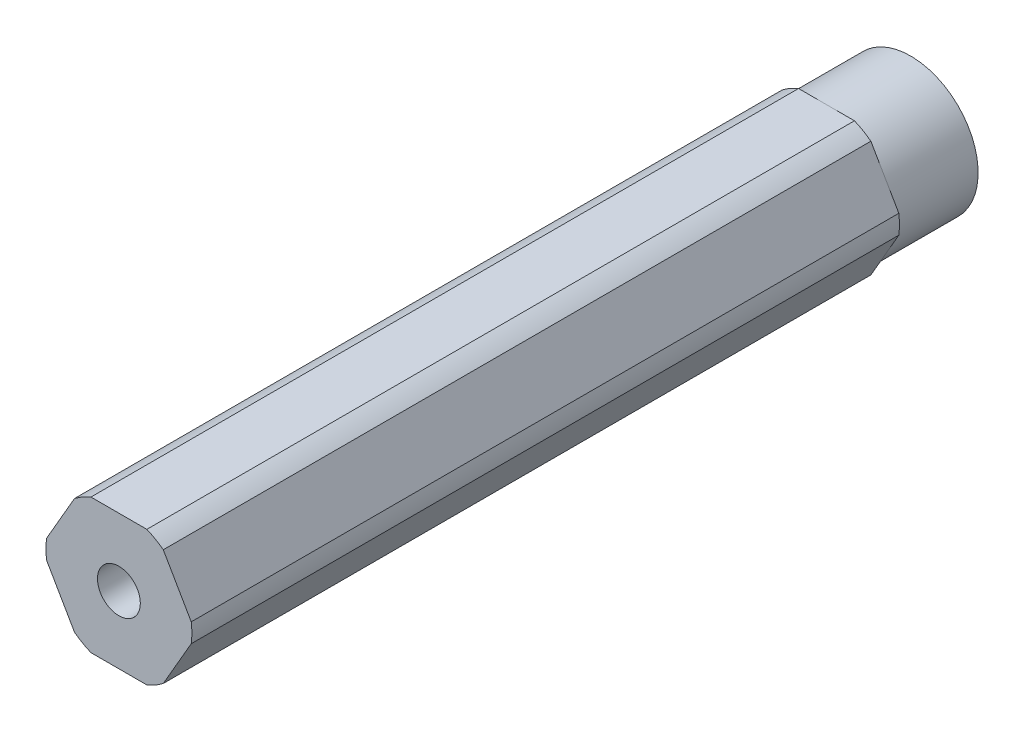
ISO-10303-21;
HEADER;
FILE_DESCRIPTION(('STEP AP214'),'2;1');
FILE_NAME('part.step','',(''),(''),'','','');
FILE_SCHEMA(('AUTOMOTIVE_DESIGN { 1 0 10303 214 1 1 1 1 }'));
ENDSEC;
DATA;
#1=APPLICATION_CONTEXT('core data for automotive mechanical design processes');
#2=APPLICATION_PROTOCOL_DEFINITION('international standard','automotive_design',2000,#1);
#3=PRODUCT_CONTEXT('',#1,'mechanical');
#4=PRODUCT('Part','Part','',(#3));
#5=PRODUCT_RELATED_PRODUCT_CATEGORY('part','',(#4));
#6=PRODUCT_DEFINITION_FORMATION('','',#4);
#7=PRODUCT_DEFINITION_CONTEXT('part definition',#1,'design');
#8=PRODUCT_DEFINITION('design','',#6,#7);
#9=PRODUCT_DEFINITION_SHAPE('','',#8);
#10=(LENGTH_UNIT() NAMED_UNIT(*) SI_UNIT(.MILLI.,.METRE.));
#11=(NAMED_UNIT(*) PLANE_ANGLE_UNIT() SI_UNIT($,.RADIAN.));
#12=(NAMED_UNIT(*) SI_UNIT($,.STERADIAN.) SOLID_ANGLE_UNIT());
#13=UNCERTAINTY_MEASURE_WITH_UNIT(LENGTH_MEASURE(1.E-05),#10,'distance_accuracy_value','');
#14=(GEOMETRIC_REPRESENTATION_CONTEXT(3) GLOBAL_UNCERTAINTY_ASSIGNED_CONTEXT((#13)) GLOBAL_UNIT_ASSIGNED_CONTEXT((#10,
#11,#12)) REPRESENTATION_CONTEXT('',''));
#15=CARTESIAN_POINT('',(0.,0.,0.));
#16=DIRECTION('',(0.,0.,1.));
#17=DIRECTION('',(1.,0.,0.));
#18=AXIS2_PLACEMENT_3D('',#15,#16,#17);
#19=CARTESIAN_POINT('',(-41.275,44.45,37.30625));
#20=DIRECTION('',(0.,0.,-1.));
#21=DIRECTION('',(-1.,0.,0.));
#22=AXIS2_PLACEMENT_3D('',#19,#20,#21);
#23=CYLINDRICAL_SURFACE('',#22,6.874999966);
#24=CARTESIAN_POINT('',(-41.275,44.45,-29.36875));
#25=DIRECTION('',(0.,0.,-1.));
#26=DIRECTION('',(-1.,0.,0.));
#27=AXIS2_PLACEMENT_3D('',#24,#25,#26);
#28=CIRCLE('',#27,6.874999966);
#29=CARTESIAN_POINT('',(-38.6400190641107,50.8,-29.36875));
#30=VERTEX_POINT('',#29);
#31=CARTESIAN_POINT('',(-37.0932291539135,49.9069604289678,-29.36875));
#32=VERTEX_POINT('',#31);
#33=EDGE_CURVE('E321',#30,#32,#28,.T.);
#34=ORIENTED_EDGE('',*,*,#33,.F.);
#35=DIRECTION('',(0.,0.,-1.));
#36=VECTOR('',#35,1.);
#37=CARTESIAN_POINT('',(-38.6400190641107,50.8,37.30625));
#38=LINE('',#37,#36);
#39=CARTESIAN_POINT('',(-38.6400190641107,50.8,37.30625));
#40=VERTEX_POINT('',#39);
#41=EDGE_CURVE('E474',#40,#30,#38,.T.);
#42=ORIENTED_EDGE('',*,*,#41,.F.);
#43=CARTESIAN_POINT('',(-41.275,44.45,37.30625));
#44=DIRECTION('',(0.,0.,1.));
#45=DIRECTION('',(1.,0.,0.));
#46=AXIS2_PLACEMENT_3D('',#43,#44,#45);
#47=CIRCLE('',#46,6.874999966);
#48=CARTESIAN_POINT('',(-37.0932291539135,49.9069604289678,37.30625));
#49=VERTEX_POINT('',#48);
#50=EDGE_CURVE('E217',#49,#40,#47,.T.);
#51=ORIENTED_EDGE('',*,*,#50,.F.);
#52=DIRECTION('',(0.,0.,-1.));
#53=VECTOR('',#52,1.);
#54=CARTESIAN_POINT('',(-37.0932291539135,49.9069604289678,37.30625));
#55=LINE('',#54,#53);
#56=EDGE_CURVE('E202',#49,#32,#55,.T.);
#57=ORIENTED_EDGE('',*,*,#56,.T.);
#58=EDGE_LOOP('',(#34,#42,#51,#57));
#59=FACE_BOUND('',#58,.T.);
#60=ADVANCED_FACE('F194',(#59),#23,.T.);
#61=CARTESIAN_POINT('',(0.,50.8000000000001,37.30625));
#62=DIRECTION('',(0.,-1.,0.));
#63=DIRECTION('',(1.,0.,0.));
#64=AXIS2_PLACEMENT_3D('',#61,#62,#63);
#65=PLANE('',#64);
#66=DIRECTION('',(1.,0.,0.));
#67=VECTOR('',#66,1.);
#68=CARTESIAN_POINT('',(0.,50.8000000000001,-29.36875));
#69=LINE('',#68,#67);
#70=CARTESIAN_POINT('',(-43.9099809358893,50.8,-29.36875));
#71=VERTEX_POINT('',#70);
#72=CARTESIAN_POINT('',(-41.275,50.8,-29.36875));
#73=VERTEX_POINT('',#72);
#74=EDGE_CURVE('E329',#71,#73,#69,.T.);
#75=ORIENTED_EDGE('',*,*,#74,.F.);
#76=DIRECTION('',(0.,0.,-1.));
#77=VECTOR('',#76,1.);
#78=CARTESIAN_POINT('',(-43.9099809358893,50.8,37.30625));
#79=LINE('',#78,#77);
#80=CARTESIAN_POINT('',(-43.9099809358893,50.8,37.30625));
#81=VERTEX_POINT('',#80);
#82=EDGE_CURVE('E264',#81,#71,#79,.T.);
#83=ORIENTED_EDGE('',*,*,#82,.F.);
#84=DIRECTION('',(-1.,0.,0.));
#85=VECTOR('',#84,1.);
#86=CARTESIAN_POINT('',(0.,50.8000000000001,37.30625));
#87=LINE('',#86,#85);
#88=EDGE_CURVE('E271',#40,#81,#87,.T.);
#89=ORIENTED_EDGE('',*,*,#88,.F.);
#90=ORIENTED_EDGE('',*,*,#41,.T.);
#91=EDGE_CURVE('E324',#73,#30,#69,.T.);
#92=ORIENTED_EDGE('',*,*,#91,.F.);
#93=EDGE_LOOP('',(#75,#83,#89,#90,#92));
#94=FACE_BOUND('',#93,.T.);
#95=ADVANCED_FACE('F482',(#94),#65,.F.);
#96=CARTESIAN_POINT('',(-6.20957408685941,-3.58509927060124,37.30625));
#97=DIRECTION('',(-0.866025403784436,-0.500000000000004,0.));
#98=DIRECTION('',(0.500000000000004,-0.866025403784436,0.));
#99=AXIS2_PLACEMENT_3D('',#96,#97,#98);
#100=PLANE('',#99);
#101=DIRECTION('',(0.500000000000004,-0.866025403784436,0.));
#102=VECTOR('',#101,1.);
#103=CARTESIAN_POINT('',(-6.20957408685941,-3.58509927060124,-29.36875));
#104=LINE('',#103,#102);
#105=CARTESIAN_POINT('',(-35.7757386859688,47.625,-29.36875));
#106=VERTEX_POINT('',#105);
#107=EDGE_CURVE('E312',#32,#106,#104,.T.);
#108=ORIENTED_EDGE('',*,*,#107,.F.);
#109=ORIENTED_EDGE('',*,*,#56,.F.);
#110=DIRECTION('',(-0.500000000000004,0.866025403784436,0.));
#111=VECTOR('',#110,1.);
#112=CARTESIAN_POINT('',(-6.20957408685941,-3.58509927060124,37.30625));
#113=LINE('',#112,#111);
#114=CARTESIAN_POINT('',(-34.4582482180242,45.3430395710322,37.30625));
#115=VERTEX_POINT('',#114);
#116=EDGE_CURVE('E440',#115,#49,#113,.T.);
#117=ORIENTED_EDGE('',*,*,#116,.F.);
#118=DIRECTION('',(0.,0.,-1.));
#119=VECTOR('',#118,1.);
#120=CARTESIAN_POINT('',(-34.4582482180242,45.3430395710322,37.30625));
#121=LINE('',#120,#119);
#122=CARTESIAN_POINT('',(-34.4582482180242,45.3430395710322,-29.36875));
#123=VERTEX_POINT('',#122);
#124=EDGE_CURVE('E436',#115,#123,#121,.T.);
#125=ORIENTED_EDGE('',*,*,#124,.T.);
#126=EDGE_CURVE('E306',#106,#123,#104,.T.);
#127=ORIENTED_EDGE('',*,*,#126,.F.);
#128=EDGE_LOOP('',(#108,#109,#117,#125,#127));
#129=FACE_BOUND('',#128,.T.);
#130=ADVANCED_FACE('F438',(#129),#100,.F.);
#131=CARTESIAN_POINT('',(0.,0.,-37.30625));
#132=DIRECTION('',(0.,0.,1.));
#133=DIRECTION('',(1.,0.,0.));
#134=AXIS2_PLACEMENT_3D('',#131,#132,#133);
#135=PLANE('',#134);
#136=CARTESIAN_POINT('',(-41.275,44.45,-37.30625));
#137=DIRECTION('',(0.,0.,1.));
#138=DIRECTION('',(1.,0.,0.));
#139=AXIS2_PLACEMENT_3D('',#136,#137,#138);
#140=CIRCLE('',#139,2.0193);
#141=CARTESIAN_POINT('',(-39.2557,44.45,-37.30625));
#142=VERTEX_POINT('',#141);
#143=EDGE_CURVE('E283',#142,#142,#140,.T.);
#144=ORIENTED_EDGE('',*,*,#143,.T.);
#145=EDGE_LOOP('',(#144));
#146=FACE_BOUND('',#145,.T.);
#147=CARTESIAN_POINT('',(-41.275,44.45,-37.30625));
#148=DIRECTION('',(0.,0.,-1.));
#149=DIRECTION('',(-1.,0.,0.));
#150=AXIS2_PLACEMENT_3D('',#147,#148,#149);
#151=CIRCLE('',#150,6.35);
#152=CARTESIAN_POINT('',(-47.625,44.45,-37.30625));
#153=VERTEX_POINT('',#152);
#154=EDGE_CURVE('E338',#153,#153,#151,.T.);
#155=ORIENTED_EDGE('',*,*,#154,.T.);
#156=EDGE_LOOP('',(#155));
#157=FACE_BOUND('',#156,.T.);
#158=ADVANCED_FACE('F502',(#146,#157),#135,.F.);
#159=CARTESIAN_POINT('',(-41.275,44.45,37.30625));
#160=DIRECTION('',(0.,0.,-1.));
#161=DIRECTION('',(-1.,0.,0.));
#162=AXIS2_PLACEMENT_3D('',#159,#160,#161);
#163=CYLINDRICAL_SURFACE('',#162,6.874999966);
#164=CARTESIAN_POINT('',(-41.275,44.45,-29.36875));
#165=DIRECTION('',(0.,0.,-1.));
#166=DIRECTION('',(-1.,0.,0.));
#167=AXIS2_PLACEMENT_3D('',#164,#165,#166);
#168=CIRCLE('',#167,6.874999966);
#169=CARTESIAN_POINT('',(-48.0917517819758,43.5569604289678,-29.36875));
#170=VERTEX_POINT('',#169);
#171=CARTESIAN_POINT('',(-48.0917517819758,45.3430395710322,-29.36875));
#172=VERTEX_POINT('',#171);
#173=EDGE_CURVE('E332',#170,#172,#168,.T.);
#174=ORIENTED_EDGE('',*,*,#173,.F.);
#175=DIRECTION('',(0.,0.,-1.));
#176=VECTOR('',#175,1.);
#177=CARTESIAN_POINT('',(-48.0917517819758,43.5569604289678,37.30625));
#178=LINE('',#177,#176);
#179=CARTESIAN_POINT('',(-48.0917517819758,43.5569604289678,37.30625));
#180=VERTEX_POINT('',#179);
#181=EDGE_CURVE('E400',#180,#170,#178,.T.);
#182=ORIENTED_EDGE('',*,*,#181,.F.);
#183=CARTESIAN_POINT('',(-41.275,44.45,37.30625));
#184=DIRECTION('',(0.,0.,1.));
#185=DIRECTION('',(1.,0.,0.));
#186=AXIS2_PLACEMENT_3D('',#183,#184,#185);
#187=CIRCLE('',#186,6.874999966);
#188=CARTESIAN_POINT('',(-48.0917517819758,45.3430395710322,37.30625));
#189=VERTEX_POINT('',#188);
#190=EDGE_CURVE('E263',#189,#180,#187,.T.);
#191=ORIENTED_EDGE('',*,*,#190,.F.);
#192=DIRECTION('',(0.,0.,-1.));
#193=VECTOR('',#192,1.);
#194=CARTESIAN_POINT('',(-48.0917517819758,45.3430395710322,37.30625));
#195=LINE('',#194,#193);
#196=EDGE_CURVE('E261',#189,#172,#195,.T.);
#197=ORIENTED_EDGE('',*,*,#196,.T.);
#198=EDGE_LOOP('',(#174,#182,#191,#197));
#199=FACE_BOUND('',#198,.T.);
#200=ADVANCED_FACE('F405',(#199),#163,.T.);
#201=CARTESIAN_POINT('',(-17.2080967149219,-9.93509927060132,37.30625));
#202=DIRECTION('',(0.866025403784437,0.500000000000003,0.));
#203=DIRECTION('',(-0.500000000000003,0.866025403784437,0.));
#204=AXIS2_PLACEMENT_3D('',#201,#202,#203);
#205=PLANE('',#204);
#206=DIRECTION('',(-0.500000000000003,0.866025403784437,0.));
#207=VECTOR('',#206,1.);
#208=CARTESIAN_POINT('',(-17.2080967149219,-9.93509927060132,-29.36875));
#209=LINE('',#208,#207);
#210=CARTESIAN_POINT('',(-45.4567708460865,38.9930395710322,-29.36875));
#211=VERTEX_POINT('',#210);
#212=CARTESIAN_POINT('',(-46.7742613140312,41.275,-29.36875));
#213=VERTEX_POINT('',#212);
#214=EDGE_CURVE('E328',#211,#213,#209,.T.);
#215=ORIENTED_EDGE('',*,*,#214,.F.);
#216=DIRECTION('',(0.,0.,-1.));
#217=VECTOR('',#216,1.);
#218=CARTESIAN_POINT('',(-45.4567708460865,38.9930395710322,37.30625));
#219=LINE('',#218,#217);
#220=CARTESIAN_POINT('',(-45.4567708460865,38.9930395710322,37.30625));
#221=VERTEX_POINT('',#220);
#222=EDGE_CURVE('E396',#221,#211,#219,.T.);
#223=ORIENTED_EDGE('',*,*,#222,.F.);
#224=DIRECTION('',(0.500000000000003,-0.866025403784437,0.));
#225=VECTOR('',#224,1.);
#226=CARTESIAN_POINT('',(-17.2080967149219,-9.93509927060132,37.30625));
#227=LINE('',#226,#225);
#228=EDGE_CURVE('E387',#180,#221,#227,.T.);
#229=ORIENTED_EDGE('',*,*,#228,.F.);
#230=ORIENTED_EDGE('',*,*,#181,.T.);
#231=EDGE_CURVE('E325',#213,#170,#209,.T.);
#232=ORIENTED_EDGE('',*,*,#231,.F.);
#233=EDGE_LOOP('',(#215,#223,#229,#230,#232));
#234=FACE_BOUND('',#233,.T.);
#235=ADVANCED_FACE('F515',(#234),#205,.F.);
#236=CARTESIAN_POINT('',(-55.7029259131403,32.1600992706013,37.30625));
#237=DIRECTION('',(0.866025403784439,-0.5,0.));
#238=DIRECTION('',(0.5,0.866025403784439,0.));
#239=AXIS2_PLACEMENT_3D('',#236,#237,#238);
#240=PLANE('',#239);
#241=DIRECTION('',(0.5,0.866025403784439,0.));
#242=VECTOR('',#241,1.);
#243=CARTESIAN_POINT('',(-55.7029259131403,32.1600992706013,-29.36875));
#244=LINE('',#243,#242);
#245=CARTESIAN_POINT('',(-46.7742613140312,47.625,-29.36875));
#246=VERTEX_POINT('',#245);
#247=EDGE_CURVE('E335',#172,#246,#244,.T.);
#248=ORIENTED_EDGE('',*,*,#247,.F.);
#249=ORIENTED_EDGE('',*,*,#196,.F.);
#250=DIRECTION('',(-0.5,-0.866025403784439,0.));
#251=VECTOR('',#250,1.);
#252=CARTESIAN_POINT('',(-55.7029259131403,32.1600992706013,37.30625));
#253=LINE('',#252,#251);
#254=CARTESIAN_POINT('',(-45.4567708460865,49.9069604289678,37.30625));
#255=VERTEX_POINT('',#254);
#256=EDGE_CURVE('E254',#255,#189,#253,.T.);
#257=ORIENTED_EDGE('',*,*,#256,.F.);
#258=DIRECTION('',(0.,0.,-1.));
#259=VECTOR('',#258,1.);
#260=CARTESIAN_POINT('',(-45.4567708460865,49.9069604289678,37.30625));
#261=LINE('',#260,#259);
#262=CARTESIAN_POINT('',(-45.4567708460865,49.9069604289678,-29.36875));
#263=VERTEX_POINT('',#262);
#264=EDGE_CURVE('E259',#255,#263,#261,.T.);
#265=ORIENTED_EDGE('',*,*,#264,.T.);
#266=EDGE_CURVE('E208',#246,#263,#244,.T.);
#267=ORIENTED_EDGE('',*,*,#266,.F.);
#268=EDGE_LOOP('',(#248,#249,#257,#265,#267));
#269=FACE_BOUND('',#268,.T.);
#270=ADVANCED_FACE('F257',(#269),#240,.F.);
#271=CARTESIAN_POINT('',(-41.275,44.45,37.30625));
#272=DIRECTION('',(0.,0.,-1.));
#273=DIRECTION('',(-1.,0.,0.));
#274=AXIS2_PLACEMENT_3D('',#271,#272,#273);
#275=CYLINDRICAL_SURFACE('',#274,6.874999966);
#276=CARTESIAN_POINT('',(-41.275,44.45,-29.36875));
#277=DIRECTION('',(0.,0.,-1.));
#278=DIRECTION('',(-1.,0.,0.));
#279=AXIS2_PLACEMENT_3D('',#276,#277,#278);
#280=CIRCLE('',#279,6.874999966);
#281=CARTESIAN_POINT('',(-43.9099809358893,38.1,-29.36875));
#282=VERTEX_POINT('',#281);
#283=EDGE_CURVE('E318',#282,#211,#280,.T.);
#284=ORIENTED_EDGE('',*,*,#283,.F.);
#285=DIRECTION('',(0.,0.,-1.));
#286=VECTOR('',#285,1.);
#287=CARTESIAN_POINT('',(-43.9099809358893,38.1,37.30625));
#288=LINE('',#287,#286);
#289=CARTESIAN_POINT('',(-43.9099809358893,38.1,37.30625));
#290=VERTEX_POINT('',#289);
#291=EDGE_CURVE('E393',#290,#282,#288,.T.);
#292=ORIENTED_EDGE('',*,*,#291,.F.);
#293=CARTESIAN_POINT('',(-41.275,44.45,37.30625));
#294=DIRECTION('',(0.,0.,1.));
#295=DIRECTION('',(1.,0.,0.));
#296=AXIS2_PLACEMENT_3D('',#293,#294,#295);
#297=CIRCLE('',#296,6.874999966);
#298=EDGE_CURVE('E390',#221,#290,#297,.T.);
#299=ORIENTED_EDGE('',*,*,#298,.F.);
#300=ORIENTED_EDGE('',*,*,#222,.T.);
#301=EDGE_LOOP('',(#284,#292,#299,#300));
#302=FACE_BOUND('',#301,.T.);
#303=ADVANCED_FACE('F511',(#302),#275,.T.);
#304=CARTESIAN_POINT('',(0.,38.1000000000001,37.30625));
#305=DIRECTION('',(0.,1.,0.));
#306=DIRECTION('',(-1.,0.,0.));
#307=AXIS2_PLACEMENT_3D('',#304,#305,#306);
#308=PLANE('',#307);
#309=DIRECTION('',(-1.,0.,0.));
#310=VECTOR('',#309,1.);
#311=CARTESIAN_POINT('',(0.,38.1000000000001,-29.36875));
#312=LINE('',#311,#310);
#313=CARTESIAN_POINT('',(-38.6400190641107,38.1,-29.36875));
#314=VERTEX_POINT('',#313);
#315=CARTESIAN_POINT('',(-41.275,38.1,-29.36875));
#316=VERTEX_POINT('',#315);
#317=EDGE_CURVE('E310',#314,#316,#312,.T.);
#318=ORIENTED_EDGE('',*,*,#317,.F.);
#319=DIRECTION('',(0.,0.,-1.));
#320=VECTOR('',#319,1.);
#321=CARTESIAN_POINT('',(-38.6400190641107,38.1,37.30625));
#322=LINE('',#321,#320);
#323=CARTESIAN_POINT('',(-38.6400190641107,38.1,37.30625));
#324=VERTEX_POINT('',#323);
#325=EDGE_CURVE('E378',#324,#314,#322,.T.);
#326=ORIENTED_EDGE('',*,*,#325,.F.);
#327=DIRECTION('',(1.,0.,0.));
#328=VECTOR('',#327,1.);
#329=CARTESIAN_POINT('',(0.,38.1000000000001,37.30625));
#330=LINE('',#329,#328);
#331=EDGE_CURVE('E383',#290,#324,#330,.T.);
#332=ORIENTED_EDGE('',*,*,#331,.F.);
#333=ORIENTED_EDGE('',*,*,#291,.T.);
#334=EDGE_CURVE('E314',#316,#282,#312,.T.);
#335=ORIENTED_EDGE('',*,*,#334,.F.);
#336=EDGE_LOOP('',(#318,#326,#332,#333,#335));
#337=FACE_BOUND('',#336,.T.);
#338=ADVANCED_FACE('F452',(#337),#308,.F.);
#339=CARTESIAN_POINT('',(-41.275,44.45,37.30625));
#340=DIRECTION('',(0.,0.,-1.));
#341=DIRECTION('',(-1.,0.,0.));
#342=AXIS2_PLACEMENT_3D('',#339,#340,#341);
#343=CYLINDRICAL_SURFACE('',#342,6.874999966);
#344=CARTESIAN_POINT('',(-41.275,44.45,-29.36875));
#345=DIRECTION('',(0.,0.,-1.));
#346=DIRECTION('',(-1.,0.,0.));
#347=AXIS2_PLACEMENT_3D('',#344,#345,#346);
#348=CIRCLE('',#347,6.874999966);
#349=CARTESIAN_POINT('',(-37.0932291539134,38.9930395710322,-29.36875));
#350=VERTEX_POINT('',#349);
#351=EDGE_CURVE('E289',#350,#314,#348,.T.);
#352=ORIENTED_EDGE('',*,*,#351,.F.);
#353=DIRECTION('',(0.,0.,-1.));
#354=VECTOR('',#353,1.);
#355=CARTESIAN_POINT('',(-37.0932291539134,38.9930395710322,37.30625));
#356=LINE('',#355,#354);
#357=CARTESIAN_POINT('',(-37.0932291539134,38.9930395710322,37.30625));
#358=VERTEX_POINT('',#357);
#359=EDGE_CURVE('E373',#358,#350,#356,.T.);
#360=ORIENTED_EDGE('',*,*,#359,.F.);
#361=CARTESIAN_POINT('',(-41.275,44.45,37.30625));
#362=DIRECTION('',(0.,0.,1.));
#363=DIRECTION('',(1.,0.,0.));
#364=AXIS2_PLACEMENT_3D('',#361,#362,#363);
#365=CIRCLE('',#364,6.874999966);
#366=EDGE_CURVE('E379',#324,#358,#365,.T.);
#367=ORIENTED_EDGE('',*,*,#366,.F.);
#368=ORIENTED_EDGE('',*,*,#325,.T.);
#369=EDGE_LOOP('',(#352,#360,#367,#368));
#370=FACE_BOUND('',#369,.T.);
#371=ADVANCED_FACE('F454',(#370),#343,.T.);
#372=CARTESIAN_POINT('',(-44.704403285078,25.8100992706012,37.30625));
#373=DIRECTION('',(-0.86602540378444,0.499999999999998,0.));
#374=DIRECTION('',(-0.499999999999998,-0.86602540378444,0.));
#375=AXIS2_PLACEMENT_3D('',#372,#373,#374);
#376=PLANE('',#375);
#377=DIRECTION('',(-0.499999999999998,-0.86602540378444,0.));
#378=VECTOR('',#377,1.);
#379=CARTESIAN_POINT('',(-44.704403285078,25.8100992706012,-29.36875));
#380=LINE('',#379,#378);
#381=CARTESIAN_POINT('',(-34.4582482180242,43.5569604289678,-29.36875));
#382=VERTEX_POINT('',#381);
#383=CARTESIAN_POINT('',(-35.7757386859688,41.275,-29.36875));
#384=VERTEX_POINT('',#383);
#385=EDGE_CURVE('E291',#382,#384,#380,.T.);
#386=ORIENTED_EDGE('',*,*,#385,.F.);
#387=DIRECTION('',(0.,0.,-1.));
#388=VECTOR('',#387,1.);
#389=CARTESIAN_POINT('',(-34.4582482180242,43.5569604289678,37.30625));
#390=LINE('',#389,#388);
#391=CARTESIAN_POINT('',(-34.4582482180242,43.5569604289678,37.30625));
#392=VERTEX_POINT('',#391);
#393=EDGE_CURVE('E437',#392,#382,#390,.T.);
#394=ORIENTED_EDGE('',*,*,#393,.F.);
#395=DIRECTION('',(0.499999999999998,0.86602540378444,0.));
#396=VECTOR('',#395,1.);
#397=CARTESIAN_POINT('',(-44.704403285078,25.8100992706012,37.30625));
#398=LINE('',#397,#396);
#399=EDGE_CURVE('E375',#358,#392,#398,.T.);
#400=ORIENTED_EDGE('',*,*,#399,.F.);
#401=ORIENTED_EDGE('',*,*,#359,.T.);
#402=EDGE_CURVE('E285',#384,#350,#380,.T.);
#403=ORIENTED_EDGE('',*,*,#402,.F.);
#404=EDGE_LOOP('',(#386,#394,#400,#401,#403));
#405=FACE_BOUND('',#404,.T.);
#406=ADVANCED_FACE('F369',(#405),#376,.F.);
#407=CARTESIAN_POINT('',(-41.275,44.45,37.30625));
#408=DIRECTION('',(0.,0.,-1.));
#409=DIRECTION('',(-1.,0.,0.));
#410=AXIS2_PLACEMENT_3D('',#407,#408,#409);
#411=CYLINDRICAL_SURFACE('',#410,6.874999966);
#412=CARTESIAN_POINT('',(-41.275,44.45,-29.36875));
#413=DIRECTION('',(0.,0.,-1.));
#414=DIRECTION('',(-1.,0.,0.));
#415=AXIS2_PLACEMENT_3D('',#412,#413,#414);
#416=CIRCLE('',#415,6.874999966);
#417=EDGE_CURVE('E300',#123,#382,#416,.T.);
#418=ORIENTED_EDGE('',*,*,#417,.F.);
#419=ORIENTED_EDGE('',*,*,#124,.F.);
#420=CARTESIAN_POINT('',(-41.275,44.45,37.30625));
#421=DIRECTION('',(0.,0.,1.));
#422=DIRECTION('',(1.,0.,0.));
#423=AXIS2_PLACEMENT_3D('',#420,#421,#422);
#424=CIRCLE('',#423,6.874999966);
#425=EDGE_CURVE('E442',#392,#115,#424,.T.);
#426=ORIENTED_EDGE('',*,*,#425,.F.);
#427=ORIENTED_EDGE('',*,*,#393,.T.);
#428=EDGE_LOOP('',(#418,#419,#426,#427));
#429=FACE_BOUND('',#428,.T.);
#430=ADVANCED_FACE('F435',(#429),#411,.T.);
#431=CARTESIAN_POINT('',(-41.275,44.45,37.30625));
#432=DIRECTION('',(0.,0.,-1.));
#433=DIRECTION('',(-1.,0.,0.));
#434=AXIS2_PLACEMENT_3D('',#431,#432,#433);
#435=CYLINDRICAL_SURFACE('',#434,6.874999966);
#436=CARTESIAN_POINT('',(-41.275,44.45,-29.36875));
#437=DIRECTION('',(0.,0.,-1.));
#438=DIRECTION('',(-1.,0.,0.));
#439=AXIS2_PLACEMENT_3D('',#436,#437,#438);
#440=CIRCLE('',#439,6.874999966);
#441=EDGE_CURVE('E13',#263,#71,#440,.T.);
#442=ORIENTED_EDGE('',*,*,#441,.F.);
#443=ORIENTED_EDGE('',*,*,#264,.F.);
#444=CARTESIAN_POINT('',(-41.275,44.45,37.30625));
#445=DIRECTION('',(0.,0.,1.));
#446=DIRECTION('',(1.,0.,0.));
#447=AXIS2_PLACEMENT_3D('',#444,#445,#446);
#448=CIRCLE('',#447,6.874999966);
#449=EDGE_CURVE('E267',#81,#255,#448,.T.);
#450=ORIENTED_EDGE('',*,*,#449,.F.);
#451=ORIENTED_EDGE('',*,*,#82,.T.);
#452=EDGE_LOOP('',(#442,#443,#450,#451));
#453=FACE_BOUND('',#452,.T.);
#454=ADVANCED_FACE('F277',(#453),#435,.T.);
#455=CARTESIAN_POINT('',(0.,0.,37.30625));
#456=DIRECTION('',(0.,0.,1.));
#457=DIRECTION('',(1.,0.,0.));
#458=AXIS2_PLACEMENT_3D('',#455,#456,#457);
#459=PLANE('',#458);
#460=ORIENTED_EDGE('',*,*,#116,.T.);
#461=ORIENTED_EDGE('',*,*,#50,.T.);
#462=ORIENTED_EDGE('',*,*,#88,.T.);
#463=ORIENTED_EDGE('',*,*,#449,.T.);
#464=ORIENTED_EDGE('',*,*,#256,.T.);
#465=ORIENTED_EDGE('',*,*,#190,.T.);
#466=ORIENTED_EDGE('',*,*,#228,.T.);
#467=ORIENTED_EDGE('',*,*,#298,.T.);
#468=ORIENTED_EDGE('',*,*,#331,.T.);
#469=ORIENTED_EDGE('',*,*,#366,.T.);
#470=ORIENTED_EDGE('',*,*,#399,.T.);
#471=ORIENTED_EDGE('',*,*,#425,.T.);
#472=EDGE_LOOP('',(#460,#461,#462,#463,#464,#465,#466,#467,#468,#469,#470,#471));
#473=FACE_BOUND('',#472,.T.);
#474=CARTESIAN_POINT('',(-41.275,44.45,37.30625));
#475=DIRECTION('',(0.,0.,1.));
#476=DIRECTION('',(1.,0.,0.));
#477=AXIS2_PLACEMENT_3D('',#474,#475,#476);
#478=CIRCLE('',#477,2.0193);
#479=CARTESIAN_POINT('',(-39.2557,44.45,37.30625));
#480=VERTEX_POINT('',#479);
#481=EDGE_CURVE('E275',#480,#480,#478,.T.);
#482=ORIENTED_EDGE('',*,*,#481,.F.);
#483=EDGE_LOOP('',(#482));
#484=FACE_BOUND('',#483,.T.);
#485=ADVANCED_FACE('F268',(#473,#484),#459,.T.);
#486=CARTESIAN_POINT('',(-41.275,44.45,37.30625));
#487=DIRECTION('',(0.,0.,-1.));
#488=DIRECTION('',(-1.,0.,0.));
#489=AXIS2_PLACEMENT_3D('',#486,#487,#488);
#490=CYLINDRICAL_SURFACE('',#489,2.0193);
#491=ORIENTED_EDGE('',*,*,#481,.T.);
#492=EDGE_LOOP('',(#491));
#493=FACE_BOUND('',#492,.T.);
#494=ORIENTED_EDGE('',*,*,#143,.F.);
#495=EDGE_LOOP('',(#494));
#496=FACE_BOUND('',#495,.T.);
#497=ADVANCED_FACE('F196',(#493,#496),#490,.F.);
#498=CARTESIAN_POINT('',(-41.275,44.45,-29.36875));
#499=DIRECTION('',(0.,0.,-1.));
#500=DIRECTION('',(-1.,0.,0.));
#501=AXIS2_PLACEMENT_3D('',#498,#499,#500);
#502=CYLINDRICAL_SURFACE('',#501,6.35);
#503=ORIENTED_EDGE('',*,*,#154,.F.);
#504=EDGE_LOOP('',(#503));
#505=FACE_BOUND('',#504,.T.);
#506=CARTESIAN_POINT('',(-41.275,44.45,-29.36875));
#507=DIRECTION('',(0.,0.,-1.));
#508=DIRECTION('',(-1.,0.,0.));
#509=AXIS2_PLACEMENT_3D('',#506,#507,#508);
#510=CIRCLE('',#509,6.35);
#511=EDGE_CURVE('E337',#246,#73,#510,.T.);
#512=ORIENTED_EDGE('',*,*,#511,.T.);
#513=EDGE_CURVE('E343',#73,#106,#510,.T.);
#514=ORIENTED_EDGE('',*,*,#513,.T.);
#515=EDGE_CURVE('E349',#106,#384,#510,.T.);
#516=ORIENTED_EDGE('',*,*,#515,.T.);
#517=EDGE_CURVE('E354',#384,#316,#510,.T.);
#518=ORIENTED_EDGE('',*,*,#517,.T.);
#519=EDGE_CURVE('E350',#316,#213,#510,.T.);
#520=ORIENTED_EDGE('',*,*,#519,.T.);
#521=EDGE_CURVE('E341',#213,#246,#510,.T.);
#522=ORIENTED_EDGE('',*,*,#521,.T.);
#523=EDGE_LOOP('',(#512,#514,#516,#518,#520,#522));
#524=FACE_BOUND('',#523,.T.);
#525=ADVANCED_FACE('F362',(#505,#524),#502,.T.);
#526=CARTESIAN_POINT('',(-41.275,44.45,-29.36875));
#527=DIRECTION('',(0.,0.,-1.));
#528=DIRECTION('',(-1.,0.,0.));
#529=AXIS2_PLACEMENT_3D('',#526,#527,#528);
#530=PLANE('',#529);
#531=ORIENTED_EDGE('',*,*,#402,.T.);
#532=ORIENTED_EDGE('',*,*,#351,.T.);
#533=ORIENTED_EDGE('',*,*,#317,.T.);
#534=ORIENTED_EDGE('',*,*,#517,.F.);
#535=EDGE_LOOP('',(#531,#532,#533,#534));
#536=FACE_BOUND('',#535,.T.);
#537=ADVANCED_FACE('F455',(#536),#530,.T.);
#538=ORIENTED_EDGE('',*,*,#385,.T.);
#539=ORIENTED_EDGE('',*,*,#515,.F.);
#540=ORIENTED_EDGE('',*,*,#126,.T.);
#541=ORIENTED_EDGE('',*,*,#417,.T.);
#542=EDGE_LOOP('',(#538,#539,#540,#541));
#543=FACE_BOUND('',#542,.T.);
#544=ADVANCED_FACE('F429',(#543),#530,.T.);
#545=ORIENTED_EDGE('',*,*,#334,.T.);
#546=ORIENTED_EDGE('',*,*,#283,.T.);
#547=ORIENTED_EDGE('',*,*,#214,.T.);
#548=ORIENTED_EDGE('',*,*,#519,.F.);
#549=EDGE_LOOP('',(#545,#546,#547,#548));
#550=FACE_BOUND('',#549,.T.);
#551=ADVANCED_FACE('F459',(#550),#530,.T.);
#552=ORIENTED_EDGE('',*,*,#107,.T.);
#553=ORIENTED_EDGE('',*,*,#513,.F.);
#554=ORIENTED_EDGE('',*,*,#91,.T.);
#555=ORIENTED_EDGE('',*,*,#33,.T.);
#556=EDGE_LOOP('',(#552,#553,#554,#555));
#557=FACE_BOUND('',#556,.T.);
#558=ADVANCED_FACE('F469',(#557),#530,.T.);
#559=ORIENTED_EDGE('',*,*,#231,.T.);
#560=ORIENTED_EDGE('',*,*,#173,.T.);
#561=ORIENTED_EDGE('',*,*,#247,.T.);
#562=ORIENTED_EDGE('',*,*,#521,.F.);
#563=EDGE_LOOP('',(#559,#560,#561,#562));
#564=FACE_BOUND('',#563,.T.);
#565=ADVANCED_FACE('F464',(#564),#530,.T.);
#566=ORIENTED_EDGE('',*,*,#74,.T.);
#567=ORIENTED_EDGE('',*,*,#511,.F.);
#568=ORIENTED_EDGE('',*,*,#266,.T.);
#569=ORIENTED_EDGE('',*,*,#441,.T.);
#570=EDGE_LOOP('',(#566,#567,#568,#569));
#571=FACE_BOUND('',#570,.T.);
#572=ADVANCED_FACE('F483',(#571),#530,.T.);
#573=CLOSED_SHELL('',(#60,#95,#130,#158,#200,#235,#270,#303,#338,#371,#406,#430,#454,#485,#497,
#525,#537,#544,#551,#558,#565,#572));
#574=MANIFOLD_SOLID_BREP('B2',#573);
#575=ADVANCED_BREP_SHAPE_REPRESENTATION('',(#18,#574),#14);
#576=SHAPE_DEFINITION_REPRESENTATION(#9,#575);
ENDSEC;
END-ISO-10303-21;
